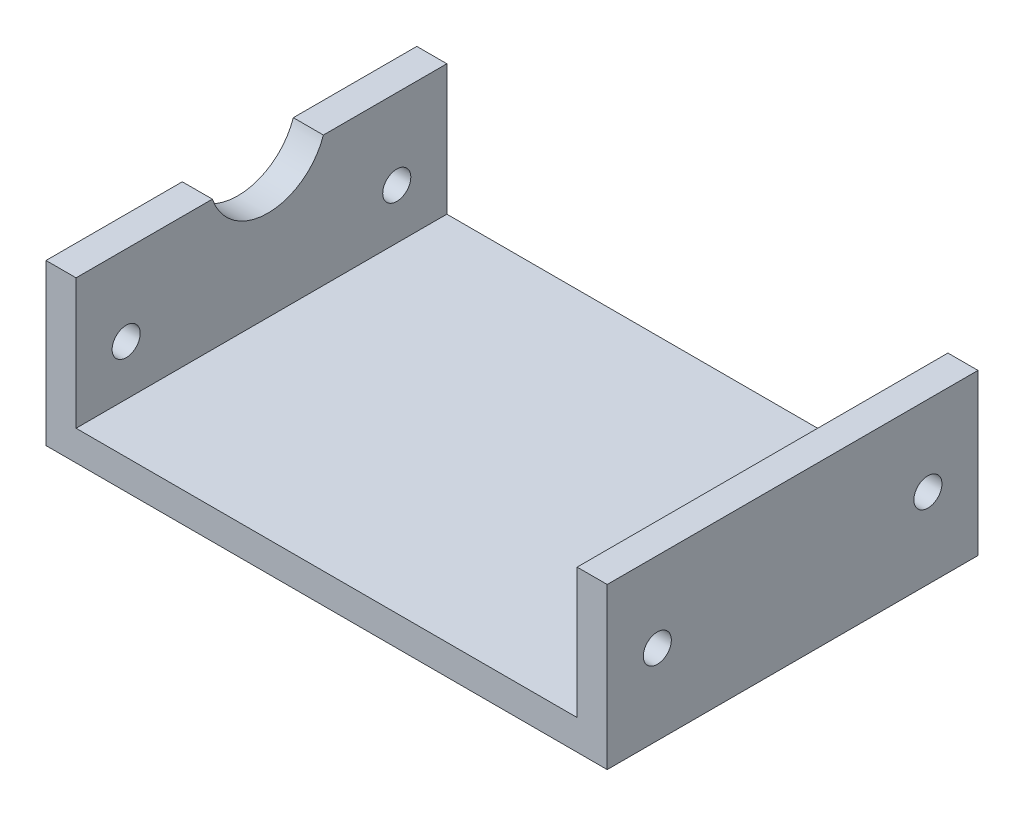
ISO-10303-21;
HEADER;
FILE_DESCRIPTION(('STEP AP214'),'2;1');
FILE_NAME('part.step','',(''),(''),'','','');
FILE_SCHEMA(('AUTOMOTIVE_DESIGN { 1 0 10303 214 1 1 1 1 }'));
ENDSEC;
DATA;
#1=APPLICATION_CONTEXT('core data for automotive mechanical design processes');
#2=APPLICATION_PROTOCOL_DEFINITION('international standard','automotive_design',2000,#1);
#3=PRODUCT_CONTEXT('',#1,'mechanical');
#4=PRODUCT('Part','Part','',(#3));
#5=PRODUCT_RELATED_PRODUCT_CATEGORY('part','',(#4));
#6=PRODUCT_DEFINITION_FORMATION('','',#4);
#7=PRODUCT_DEFINITION_CONTEXT('part definition',#1,'design');
#8=PRODUCT_DEFINITION('design','',#6,#7);
#9=PRODUCT_DEFINITION_SHAPE('','',#8);
#10=(LENGTH_UNIT() NAMED_UNIT(*) SI_UNIT(.MILLI.,.METRE.));
#11=(NAMED_UNIT(*) PLANE_ANGLE_UNIT() SI_UNIT($,.RADIAN.));
#12=(NAMED_UNIT(*) SI_UNIT($,.STERADIAN.) SOLID_ANGLE_UNIT());
#13=UNCERTAINTY_MEASURE_WITH_UNIT(LENGTH_MEASURE(1.E-05),#10,'distance_accuracy_value','');
#14=(GEOMETRIC_REPRESENTATION_CONTEXT(3) GLOBAL_UNCERTAINTY_ASSIGNED_CONTEXT((#13)) GLOBAL_UNIT_ASSIGNED_CONTEXT((#10,
#11,#12)) REPRESENTATION_CONTEXT('',''));
#15=CARTESIAN_POINT('',(0.,0.,0.));
#16=DIRECTION('',(0.,0.,1.));
#17=DIRECTION('',(1.,0.,0.));
#18=AXIS2_PLACEMENT_3D('',#15,#16,#17);
#19=CARTESIAN_POINT('',(0.,16.,0.));
#20=DIRECTION('',(0.,1.,0.));
#21=DIRECTION('',(0.,0.,1.));
#22=AXIS2_PLACEMENT_3D('',#19,#20,#21);
#23=PLANE('',#22);
#24=DIRECTION('',(-1.,0.,0.));
#25=VECTOR('',#24,1.);
#26=CARTESIAN_POINT('',(20.6146554849536,16.,-46.8530453421604));
#27=LINE('',#26,#25);
#28=CARTESIAN_POINT('',(-6.38534451504644,16.,-46.8530453421604));
#29=VERTEX_POINT('',#28);
#30=CARTESIAN_POINT('',(-9.38534451504644,16.,-46.8530453421604));
#31=VERTEX_POINT('',#30);
#32=EDGE_CURVE('E11',#29,#31,#27,.T.);
#33=ORIENTED_EDGE('',*,*,#32,.F.);
#34=DIRECTION('',(0.,0.,-1.));
#35=VECTOR('',#34,1.);
#36=CARTESIAN_POINT('',(-6.38534451504644,16.,-59.1739305312509));
#37=LINE('',#36,#35);
#38=CARTESIAN_POINT('',(-6.38534451504644,16.,-59.1739305312509));
#39=VERTEX_POINT('',#38);
#40=EDGE_CURVE('E132',#29,#39,#37,.T.);
#41=ORIENTED_EDGE('',*,*,#40,.T.);
#42=DIRECTION('',(-1.,0.,0.));
#43=VECTOR('',#42,1.);
#44=CARTESIAN_POINT('',(-9.38534451504644,16.,-59.1739305312509));
#45=LINE('',#44,#43);
#46=CARTESIAN_POINT('',(-9.38534451504644,16.,-59.1739305312509));
#47=VERTEX_POINT('',#46);
#48=EDGE_CURVE('E129',#39,#47,#45,.T.);
#49=ORIENTED_EDGE('',*,*,#48,.T.);
#50=DIRECTION('',(0.,0.,1.));
#51=VECTOR('',#50,1.);
#52=CARTESIAN_POINT('',(-9.38534451504644,16.,-59.1739305312509));
#53=LINE('',#52,#51);
#54=EDGE_CURVE('E122',#47,#31,#53,.T.);
#55=ORIENTED_EDGE('',*,*,#54,.T.);
#56=EDGE_LOOP('',(#33,#41,#49,#55));
#57=FACE_BOUND('',#56,.T.);
#58=ADVANCED_FACE('F35',(#57),#23,.T.);
#59=CARTESIAN_POINT('',(0.,3.,0.));
#60=DIRECTION('',(0.,-1.,0.));
#61=DIRECTION('',(0.,0.,-1.));
#62=AXIS2_PLACEMENT_3D('',#59,#60,#61);
#63=PLANE('',#62);
#64=DIRECTION('',(0.,0.,1.));
#65=VECTOR('',#64,1.);
#66=CARTESIAN_POINT('',(43.6146554849536,3.,-59.1739305312509));
#67=LINE('',#66,#65);
#68=CARTESIAN_POINT('',(43.6146554849536,3.,-59.1739305312509));
#69=VERTEX_POINT('',#68);
#70=CARTESIAN_POINT('',(43.6146554849535,3.,-22.1739305312509));
#71=VERTEX_POINT('',#70);
#72=EDGE_CURVE('E191',#69,#71,#67,.T.);
#73=ORIENTED_EDGE('',*,*,#72,.F.);
#74=DIRECTION('',(-1.,0.,0.));
#75=VECTOR('',#74,1.);
#76=CARTESIAN_POINT('',(-9.38534451504644,3.,-59.1739305312509));
#77=LINE('',#76,#75);
#78=CARTESIAN_POINT('',(-6.38534451504644,3.,-59.1739305312509));
#79=VERTEX_POINT('',#78);
#80=EDGE_CURVE('E163',#69,#79,#77,.T.);
#81=ORIENTED_EDGE('',*,*,#80,.T.);
#82=DIRECTION('',(0.,0.,-1.));
#83=VECTOR('',#82,1.);
#84=CARTESIAN_POINT('',(-6.38534451504644,3.,-59.1739305312509));
#85=LINE('',#84,#83);
#86=CARTESIAN_POINT('',(-6.38534451504644,3.,-22.1739305312509));
#87=VERTEX_POINT('',#86);
#88=EDGE_CURVE('E134',#87,#79,#85,.T.);
#89=ORIENTED_EDGE('',*,*,#88,.F.);
#90=DIRECTION('',(1.,0.,0.));
#91=VECTOR('',#90,1.);
#92=CARTESIAN_POINT('',(-9.38534451504644,3.,-22.1739305312509));
#93=LINE('',#92,#91);
#94=EDGE_CURVE('E59',#87,#71,#93,.T.);
#95=ORIENTED_EDGE('',*,*,#94,.T.);
#96=EDGE_LOOP('',(#73,#81,#89,#95));
#97=FACE_BOUND('',#96,.T.);
#98=ADVANCED_FACE('F240',(#97),#63,.F.);
#99=CARTESIAN_POINT('',(-9.38534451504644,3.,-22.1739305312509));
#100=DIRECTION('',(1.,0.,0.));
#101=DIRECTION('',(0.,0.,-1.));
#102=AXIS2_PLACEMENT_3D('',#99,#100,#101);
#103=PLANE('',#102);
#104=CARTESIAN_POINT('',(-9.38534451504644,8.,-54.1739305312509));
#105=DIRECTION('',(-1.,0.,0.));
#106=DIRECTION('',(0.,0.,1.));
#107=AXIS2_PLACEMENT_3D('',#104,#105,#106);
#108=CIRCLE('',#107,1.4);
#109=CARTESIAN_POINT('',(-9.38534451504644,8.,-52.7739305312509));
#110=VERTEX_POINT('',#109);
#111=EDGE_CURVE('E273',#110,#110,#108,.T.);
#112=ORIENTED_EDGE('',*,*,#111,.F.);
#113=EDGE_LOOP('',(#112));
#114=FACE_BOUND('',#113,.T.);
#115=CARTESIAN_POINT('',(-9.38534451504644,8.,-27.1739305312509));
#116=DIRECTION('',(-1.,0.,0.));
#117=DIRECTION('',(0.,0.,1.));
#118=AXIS2_PLACEMENT_3D('',#115,#116,#117);
#119=CIRCLE('',#118,1.4);
#120=CARTESIAN_POINT('',(-9.38534451504644,8.,-25.7739305312509));
#121=VERTEX_POINT('',#120);
#122=EDGE_CURVE('E276',#121,#121,#119,.T.);
#123=ORIENTED_EDGE('',*,*,#122,.F.);
#124=EDGE_LOOP('',(#123));
#125=FACE_BOUND('',#124,.T.);
#126=CARTESIAN_POINT('',(-9.38534451504644,16.,-35.775095254781));
#127=VERTEX_POINT('',#126);
#128=CARTESIAN_POINT('',(-9.38534451504644,16.,-22.1739305312509));
#129=VERTEX_POINT('',#128);
#130=EDGE_CURVE('E124',#127,#129,#53,.T.);
#131=ORIENTED_EDGE('',*,*,#130,.F.);
#132=CARTESIAN_POINT('',(-9.38534451504644,17.8592402491723,-41.3140702984707));
#133=DIRECTION('',(-1.,0.,0.));
#134=DIRECTION('',(0.,0.,1.));
#135=AXIS2_PLACEMENT_3D('',#132,#133,#134);
#136=CIRCLE('',#135,5.84268934984218);
#137=EDGE_CURVE('E51',#31,#127,#136,.T.);
#138=ORIENTED_EDGE('',*,*,#137,.F.);
#139=ORIENTED_EDGE('',*,*,#54,.F.);
#140=DIRECTION('',(0.,-1.,0.));
#141=VECTOR('',#140,1.);
#142=CARTESIAN_POINT('',(-9.38534451504644,3.,-59.1739305312509));
#143=LINE('',#142,#141);
#144=CARTESIAN_POINT('',(-9.38534451504644,0.,-59.1739305312509));
#145=VERTEX_POINT('',#144);
#146=EDGE_CURVE('E165',#47,#145,#143,.T.);
#147=ORIENTED_EDGE('',*,*,#146,.T.);
#148=DIRECTION('',(0.,0.,1.));
#149=VECTOR('',#148,1.);
#150=CARTESIAN_POINT('',(-9.38534451504644,0.,-22.1739305312509));
#151=LINE('',#150,#149);
#152=CARTESIAN_POINT('',(-9.38534451504644,0.,-22.1739305312509));
#153=VERTEX_POINT('',#152);
#154=EDGE_CURVE('E160',#145,#153,#151,.T.);
#155=ORIENTED_EDGE('',*,*,#154,.T.);
#156=DIRECTION('',(0.,-1.,0.));
#157=VECTOR('',#156,1.);
#158=CARTESIAN_POINT('',(-9.38534451504644,3.,-22.1739305312509));
#159=LINE('',#158,#157);
#160=EDGE_CURVE('E182',#129,#153,#159,.T.);
#161=ORIENTED_EDGE('',*,*,#160,.F.);
#162=EDGE_LOOP('',(#131,#138,#139,#147,#155,#161));
#163=FACE_BOUND('',#162,.T.);
#164=ADVANCED_FACE('F37',(#114,#125,#163),#103,.F.);
#165=CARTESIAN_POINT('',(-9.38534451504644,3.,-22.1739305312509));
#166=DIRECTION('',(0.,0.,-1.));
#167=DIRECTION('',(-1.,0.,0.));
#168=AXIS2_PLACEMENT_3D('',#165,#166,#167);
#169=PLANE('',#168);
#170=DIRECTION('',(1.,0.,0.));
#171=VECTOR('',#170,1.);
#172=CARTESIAN_POINT('',(-9.38534451504644,0.,-22.1739305312509));
#173=LINE('',#172,#171);
#174=CARTESIAN_POINT('',(46.6146554849536,0.,-22.1739305312509));
#175=VERTEX_POINT('',#174);
#176=EDGE_CURVE('E170',#153,#175,#173,.T.);
#177=ORIENTED_EDGE('',*,*,#176,.T.);
#178=DIRECTION('',(0.,-1.,0.));
#179=VECTOR('',#178,1.);
#180=CARTESIAN_POINT('',(46.6146554849536,3.,-22.1739305312509));
#181=LINE('',#180,#179);
#182=CARTESIAN_POINT('',(46.6146554849536,16.,-22.1739305312509));
#183=VERTEX_POINT('',#182);
#184=EDGE_CURVE('E180',#183,#175,#181,.T.);
#185=ORIENTED_EDGE('',*,*,#184,.F.);
#186=DIRECTION('',(1.,0.,0.));
#187=VECTOR('',#186,1.);
#188=CARTESIAN_POINT('',(46.6146554849536,16.,-22.1739305312509));
#189=LINE('',#188,#187);
#190=CARTESIAN_POINT('',(43.6146554849536,16.,-22.1739305312509));
#191=VERTEX_POINT('',#190);
#192=EDGE_CURVE('E221',#191,#183,#189,.T.);
#193=ORIENTED_EDGE('',*,*,#192,.F.);
#194=DIRECTION('',(0.,-1.,0.));
#195=VECTOR('',#194,1.);
#196=CARTESIAN_POINT('',(43.6146554849536,16.,-22.1739305312509));
#197=LINE('',#196,#195);
#198=EDGE_CURVE('E222',#191,#71,#197,.T.);
#199=ORIENTED_EDGE('',*,*,#198,.T.);
#200=ORIENTED_EDGE('',*,*,#94,.F.);
#201=DIRECTION('',(0.,-1.,0.));
#202=VECTOR('',#201,1.);
#203=CARTESIAN_POINT('',(-6.38534451504644,16.,-22.1739305312509));
#204=LINE('',#203,#202);
#205=CARTESIAN_POINT('',(-6.38534451504644,16.,-22.1739305312509));
#206=VERTEX_POINT('',#205);
#207=EDGE_CURVE('E155',#206,#87,#204,.T.);
#208=ORIENTED_EDGE('',*,*,#207,.F.);
#209=DIRECTION('',(1.,0.,0.));
#210=VECTOR('',#209,1.);
#211=CARTESIAN_POINT('',(-9.38534451504644,16.,-22.1739305312509));
#212=LINE('',#211,#210);
#213=EDGE_CURVE('E130',#129,#206,#212,.T.);
#214=ORIENTED_EDGE('',*,*,#213,.F.);
#215=ORIENTED_EDGE('',*,*,#160,.T.);
#216=EDGE_LOOP('',(#177,#185,#193,#199,#200,#208,#214,#215));
#217=FACE_BOUND('',#216,.T.);
#218=ADVANCED_FACE('F195',(#217),#169,.F.);
#219=CARTESIAN_POINT('',(46.6146554849536,3.,-22.1739305312509));
#220=DIRECTION('',(-1.,0.,0.));
#221=DIRECTION('',(0.,0.,1.));
#222=AXIS2_PLACEMENT_3D('',#219,#220,#221);
#223=PLANE('',#222);
#224=CARTESIAN_POINT('',(46.6146554849536,8.,-54.1739305312509));
#225=DIRECTION('',(-1.,0.,0.));
#226=DIRECTION('',(0.,0.,1.));
#227=AXIS2_PLACEMENT_3D('',#224,#225,#226);
#228=CIRCLE('',#227,1.4);
#229=CARTESIAN_POINT('',(46.6146554849536,8.,-52.7739305312509));
#230=VERTEX_POINT('',#229);
#231=EDGE_CURVE('E279',#230,#230,#228,.T.);
#232=ORIENTED_EDGE('',*,*,#231,.T.);
#233=EDGE_LOOP('',(#232));
#234=FACE_BOUND('',#233,.T.);
#235=CARTESIAN_POINT('',(46.6146554849536,8.,-27.1739305312509));
#236=DIRECTION('',(-1.,0.,0.));
#237=DIRECTION('',(0.,0.,1.));
#238=AXIS2_PLACEMENT_3D('',#235,#236,#237);
#239=CIRCLE('',#238,1.4);
#240=CARTESIAN_POINT('',(46.6146554849536,8.,-25.7739305312509));
#241=VERTEX_POINT('',#240);
#242=EDGE_CURVE('E125',#241,#241,#239,.T.);
#243=ORIENTED_EDGE('',*,*,#242,.T.);
#244=EDGE_LOOP('',(#243));
#245=FACE_BOUND('',#244,.T.);
#246=DIRECTION('',(0.,0.,-1.));
#247=VECTOR('',#246,1.);
#248=CARTESIAN_POINT('',(46.6146554849536,0.,-22.1739305312509));
#249=LINE('',#248,#247);
#250=CARTESIAN_POINT('',(46.6146554849536,0.,-59.1739305312509));
#251=VERTEX_POINT('',#250);
#252=EDGE_CURVE('E172',#175,#251,#249,.T.);
#253=ORIENTED_EDGE('',*,*,#252,.T.);
#254=DIRECTION('',(0.,-1.,0.));
#255=VECTOR('',#254,1.);
#256=CARTESIAN_POINT('',(46.6146554849536,3.,-59.1739305312509));
#257=LINE('',#256,#255);
#258=CARTESIAN_POINT('',(46.6146554849536,16.,-59.1739305312509));
#259=VERTEX_POINT('',#258);
#260=EDGE_CURVE('E177',#259,#251,#257,.T.);
#261=ORIENTED_EDGE('',*,*,#260,.F.);
#262=DIRECTION('',(0.,0.,-1.));
#263=VECTOR('',#262,1.);
#264=CARTESIAN_POINT('',(46.6146554849536,16.,-59.1739305312509));
#265=LINE('',#264,#263);
#266=EDGE_CURVE('E211',#183,#259,#265,.T.);
#267=ORIENTED_EDGE('',*,*,#266,.F.);
#268=ORIENTED_EDGE('',*,*,#184,.T.);
#269=EDGE_LOOP('',(#253,#261,#267,#268));
#270=FACE_BOUND('',#269,.T.);
#271=ADVANCED_FACE('F209',(#234,#245,#270),#223,.F.);
#272=CARTESIAN_POINT('',(-9.38534451504644,3.,-59.1739305312509));
#273=DIRECTION('',(0.,0.,1.));
#274=DIRECTION('',(1.,0.,0.));
#275=AXIS2_PLACEMENT_3D('',#272,#273,#274);
#276=PLANE('',#275);
#277=DIRECTION('',(-1.,0.,0.));
#278=VECTOR('',#277,1.);
#279=CARTESIAN_POINT('',(-9.38534451504644,0.,-59.1739305312509));
#280=LINE('',#279,#278);
#281=EDGE_CURVE('E174',#251,#145,#280,.T.);
#282=ORIENTED_EDGE('',*,*,#281,.T.);
#283=ORIENTED_EDGE('',*,*,#146,.F.);
#284=ORIENTED_EDGE('',*,*,#48,.F.);
#285=DIRECTION('',(0.,-1.,0.));
#286=VECTOR('',#285,1.);
#287=CARTESIAN_POINT('',(-6.38534451504644,16.,-59.1739305312509));
#288=LINE('',#287,#286);
#289=EDGE_CURVE('E143',#39,#79,#288,.T.);
#290=ORIENTED_EDGE('',*,*,#289,.T.);
#291=ORIENTED_EDGE('',*,*,#80,.F.);
#292=DIRECTION('',(0.,-1.,0.));
#293=VECTOR('',#292,1.);
#294=CARTESIAN_POINT('',(43.6146554849536,16.,-59.1739305312509));
#295=LINE('',#294,#293);
#296=CARTESIAN_POINT('',(43.6146554849536,16.,-59.1739305312509));
#297=VERTEX_POINT('',#296);
#298=EDGE_CURVE('E136',#297,#69,#295,.T.);
#299=ORIENTED_EDGE('',*,*,#298,.F.);
#300=DIRECTION('',(-1.,0.,0.));
#301=VECTOR('',#300,1.);
#302=CARTESIAN_POINT('',(46.6146554849536,16.,-59.1739305312509));
#303=LINE('',#302,#301);
#304=EDGE_CURVE('E214',#259,#297,#303,.T.);
#305=ORIENTED_EDGE('',*,*,#304,.F.);
#306=ORIENTED_EDGE('',*,*,#260,.T.);
#307=EDGE_LOOP('',(#282,#283,#284,#290,#291,#299,#305,#306));
#308=FACE_BOUND('',#307,.T.);
#309=ADVANCED_FACE('F198',(#308),#276,.F.);
#310=CARTESIAN_POINT('',(0.,0.,0.));
#311=DIRECTION('',(0.,-1.,0.));
#312=DIRECTION('',(0.,0.,-1.));
#313=AXIS2_PLACEMENT_3D('',#310,#311,#312);
#314=PLANE('',#313);
#315=ORIENTED_EDGE('',*,*,#154,.F.);
#316=ORIENTED_EDGE('',*,*,#281,.F.);
#317=ORIENTED_EDGE('',*,*,#252,.F.);
#318=ORIENTED_EDGE('',*,*,#176,.F.);
#319=EDGE_LOOP('',(#315,#316,#317,#318));
#320=FACE_BOUND('',#319,.T.);
#321=ADVANCED_FACE('F203',(#320),#314,.T.);
#322=CARTESIAN_POINT('',(-6.38534451504644,16.,-59.1739305312509));
#323=DIRECTION('',(-1.,0.,0.));
#324=DIRECTION('',(0.,0.,1.));
#325=AXIS2_PLACEMENT_3D('',#322,#323,#324);
#326=PLANE('',#325);
#327=CARTESIAN_POINT('',(-6.38534451504644,8.,-54.1739305312509));
#328=DIRECTION('',(-1.,0.,0.));
#329=DIRECTION('',(0.,0.,1.));
#330=AXIS2_PLACEMENT_3D('',#327,#328,#329);
#331=CIRCLE('',#330,1.4);
#332=CARTESIAN_POINT('',(-6.38534451504644,8.,-52.7739305312509));
#333=VERTEX_POINT('',#332);
#334=EDGE_CURVE('E284',#333,#333,#331,.T.);
#335=ORIENTED_EDGE('',*,*,#334,.T.);
#336=EDGE_LOOP('',(#335));
#337=FACE_BOUND('',#336,.T.);
#338=CARTESIAN_POINT('',(-6.38534451504643,8.,-27.1739305312509));
#339=DIRECTION('',(-1.,0.,0.));
#340=DIRECTION('',(0.,0.,1.));
#341=AXIS2_PLACEMENT_3D('',#338,#339,#340);
#342=CIRCLE('',#341,1.4);
#343=CARTESIAN_POINT('',(-6.38534451504643,8.,-25.7739305312509));
#344=VERTEX_POINT('',#343);
#345=EDGE_CURVE('E282',#344,#344,#342,.T.);
#346=ORIENTED_EDGE('',*,*,#345,.T.);
#347=EDGE_LOOP('',(#346));
#348=FACE_BOUND('',#347,.T.);
#349=ORIENTED_EDGE('',*,*,#40,.F.);
#350=CARTESIAN_POINT('',(-6.38534451504644,17.8592402491723,-41.3140702984707));
#351=DIRECTION('',(-1.,0.,0.));
#352=DIRECTION('',(0.,0.,1.));
#353=AXIS2_PLACEMENT_3D('',#350,#351,#352);
#354=CIRCLE('',#353,5.84268934984218);
#355=CARTESIAN_POINT('',(-6.38534451504644,16.,-35.775095254781));
#356=VERTEX_POINT('',#355);
#357=EDGE_CURVE('E114',#29,#356,#354,.T.);
#358=ORIENTED_EDGE('',*,*,#357,.T.);
#359=EDGE_CURVE('E139',#206,#356,#37,.T.);
#360=ORIENTED_EDGE('',*,*,#359,.F.);
#361=ORIENTED_EDGE('',*,*,#207,.T.);
#362=ORIENTED_EDGE('',*,*,#88,.T.);
#363=ORIENTED_EDGE('',*,*,#289,.F.);
#364=EDGE_LOOP('',(#349,#358,#360,#361,#362,#363));
#365=FACE_BOUND('',#364,.T.);
#366=ADVANCED_FACE('F189',(#337,#348,#365),#326,.F.);
#367=DIRECTION('',(-1.,0.,0.));
#368=VECTOR('',#367,1.);
#369=CARTESIAN_POINT('',(20.6146554849536,16.,-35.775095254781));
#370=LINE('',#369,#368);
#371=EDGE_CURVE('E44',#127,#356,#370,.F.);
#372=ORIENTED_EDGE('',*,*,#371,.F.);
#373=ORIENTED_EDGE('',*,*,#130,.T.);
#374=ORIENTED_EDGE('',*,*,#213,.T.);
#375=ORIENTED_EDGE('',*,*,#359,.T.);
#376=EDGE_LOOP('',(#372,#373,#374,#375));
#377=FACE_BOUND('',#376,.T.);
#378=ADVANCED_FACE('F193',(#377),#23,.T.);
#379=CARTESIAN_POINT('',(43.6146554849536,16.,-59.1739305312509));
#380=DIRECTION('',(1.,0.,0.));
#381=DIRECTION('',(0.,0.,-1.));
#382=AXIS2_PLACEMENT_3D('',#379,#380,#381);
#383=PLANE('',#382);
#384=CARTESIAN_POINT('',(43.6146554849536,8.,-54.1739305312509));
#385=DIRECTION('',(1.,0.,0.));
#386=DIRECTION('',(0.,0.,-1.));
#387=AXIS2_PLACEMENT_3D('',#384,#385,#386);
#388=CIRCLE('',#387,1.4);
#389=CARTESIAN_POINT('',(43.6146554849536,8.,-55.5739305312509));
#390=VERTEX_POINT('',#389);
#391=EDGE_CURVE('E39',#390,#390,#388,.T.);
#392=ORIENTED_EDGE('',*,*,#391,.T.);
#393=EDGE_LOOP('',(#392));
#394=FACE_BOUND('',#393,.T.);
#395=CARTESIAN_POINT('',(43.6146554849536,8.,-27.1739305312509));
#396=DIRECTION('',(1.,0.,0.));
#397=DIRECTION('',(0.,0.,-1.));
#398=AXIS2_PLACEMENT_3D('',#395,#396,#397);
#399=CIRCLE('',#398,1.4);
#400=CARTESIAN_POINT('',(43.6146554849536,8.,-28.5739305312509));
#401=VERTEX_POINT('',#400);
#402=EDGE_CURVE('E278',#401,#401,#399,.T.);
#403=ORIENTED_EDGE('',*,*,#402,.T.);
#404=EDGE_LOOP('',(#403));
#405=FACE_BOUND('',#404,.T.);
#406=ORIENTED_EDGE('',*,*,#72,.T.);
#407=ORIENTED_EDGE('',*,*,#198,.F.);
#408=DIRECTION('',(0.,0.,1.));
#409=VECTOR('',#408,1.);
#410=CARTESIAN_POINT('',(43.6146554849536,16.,-59.1739305312509));
#411=LINE('',#410,#409);
#412=EDGE_CURVE('E216',#297,#191,#411,.T.);
#413=ORIENTED_EDGE('',*,*,#412,.F.);
#414=ORIENTED_EDGE('',*,*,#298,.T.);
#415=EDGE_LOOP('',(#406,#407,#413,#414));
#416=FACE_BOUND('',#415,.T.);
#417=ADVANCED_FACE('F227',(#394,#405,#416),#383,.F.);
#418=CARTESIAN_POINT('',(0.,16.,0.));
#419=DIRECTION('',(0.,-1.,0.));
#420=DIRECTION('',(0.,0.,-1.));
#421=AXIS2_PLACEMENT_3D('',#418,#419,#420);
#422=PLANE('',#421);
#423=ORIENTED_EDGE('',*,*,#266,.T.);
#424=ORIENTED_EDGE('',*,*,#304,.T.);
#425=ORIENTED_EDGE('',*,*,#412,.T.);
#426=ORIENTED_EDGE('',*,*,#192,.T.);
#427=EDGE_LOOP('',(#423,#424,#425,#426));
#428=FACE_BOUND('',#427,.T.);
#429=ADVANCED_FACE('F228',(#428),#422,.F.);
#430=CARTESIAN_POINT('',(20.6146554849536,17.8592402491723,-41.3140702984707));
#431=DIRECTION('',(-1.,0.,0.));
#432=DIRECTION('',(0.,0.,1.));
#433=AXIS2_PLACEMENT_3D('',#430,#431,#432);
#434=CYLINDRICAL_SURFACE('',#433,5.84268934984218);
#435=ORIENTED_EDGE('',*,*,#32,.T.);
#436=ORIENTED_EDGE('',*,*,#137,.T.);
#437=ORIENTED_EDGE('',*,*,#371,.T.);
#438=ORIENTED_EDGE('',*,*,#357,.F.);
#439=EDGE_LOOP('',(#435,#436,#437,#438));
#440=FACE_BOUND('',#439,.T.);
#441=ADVANCED_FACE('F112',(#440),#434,.F.);
#442=CARTESIAN_POINT('',(50.6146554849536,8.,-27.1739305312509));
#443=DIRECTION('',(-1.,0.,0.));
#444=DIRECTION('',(0.,0.,1.));
#445=AXIS2_PLACEMENT_3D('',#442,#443,#444);
#446=CYLINDRICAL_SURFACE('',#445,1.4);
#447=ORIENTED_EDGE('',*,*,#402,.F.);
#448=EDGE_LOOP('',(#447));
#449=FACE_BOUND('',#448,.T.);
#450=ORIENTED_EDGE('',*,*,#242,.F.);
#451=EDGE_LOOP('',(#450));
#452=FACE_BOUND('',#451,.T.);
#453=ADVANCED_FACE('F235',(#449,#452),#446,.F.);
#454=ORIENTED_EDGE('',*,*,#122,.T.);
#455=EDGE_LOOP('',(#454));
#456=FACE_BOUND('',#455,.T.);
#457=ORIENTED_EDGE('',*,*,#345,.F.);
#458=EDGE_LOOP('',(#457));
#459=FACE_BOUND('',#458,.T.);
#460=ADVANCED_FACE('F295',(#456,#459),#446,.F.);
#461=CARTESIAN_POINT('',(50.6146554849536,8.,-54.1739305312509));
#462=DIRECTION('',(-1.,0.,0.));
#463=DIRECTION('',(0.,0.,1.));
#464=AXIS2_PLACEMENT_3D('',#461,#462,#463);
#465=CYLINDRICAL_SURFACE('',#464,1.4);
#466=ORIENTED_EDGE('',*,*,#391,.F.);
#467=EDGE_LOOP('',(#466));
#468=FACE_BOUND('',#467,.T.);
#469=ORIENTED_EDGE('',*,*,#231,.F.);
#470=EDGE_LOOP('',(#469));
#471=FACE_BOUND('',#470,.T.);
#472=ADVANCED_FACE('F301',(#468,#471),#465,.F.);
#473=ORIENTED_EDGE('',*,*,#111,.T.);
#474=EDGE_LOOP('',(#473));
#475=FACE_BOUND('',#474,.T.);
#476=ORIENTED_EDGE('',*,*,#334,.F.);
#477=EDGE_LOOP('',(#476));
#478=FACE_BOUND('',#477,.T.);
#479=ADVANCED_FACE('F305',(#475,#478),#465,.F.);
#480=CLOSED_SHELL('',(#58,#98,#164,#218,#271,#309,#321,#366,#378,#417,#429,#441,#453,#460,#472,#479));
#481=MANIFOLD_SOLID_BREP('B2',#480);
#482=ADVANCED_BREP_SHAPE_REPRESENTATION('',(#18,#481),#14);
#483=SHAPE_DEFINITION_REPRESENTATION(#9,#482);
ENDSEC;
END-ISO-10303-21;
